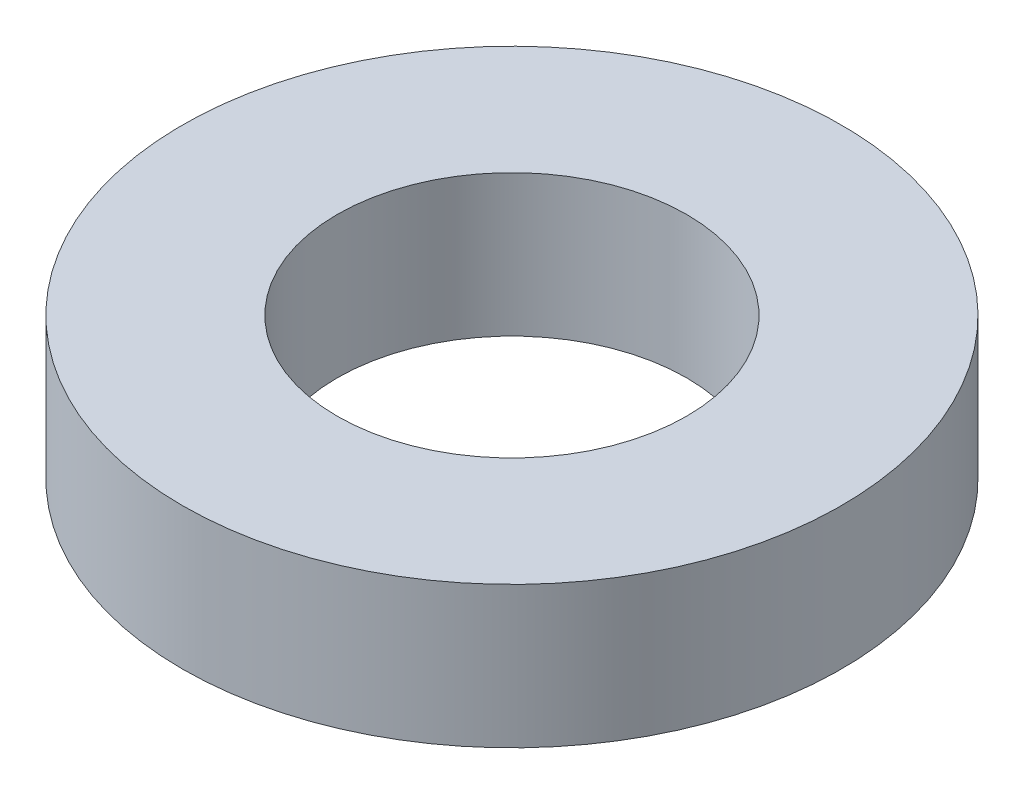
ISO-10303-21;
HEADER;
FILE_DESCRIPTION(('STEP AP214'),'2;1');
FILE_NAME('part.step','',(''),(''),'','','');
FILE_SCHEMA(('AUTOMOTIVE_DESIGN { 1 0 10303 214 1 1 1 1 }'));
ENDSEC;
DATA;
#1=APPLICATION_CONTEXT('core data for automotive mechanical design processes');
#2=APPLICATION_PROTOCOL_DEFINITION('international standard','automotive_design',2000,#1);
#3=PRODUCT_CONTEXT('',#1,'mechanical');
#4=PRODUCT('Part','Part','',(#3));
#5=PRODUCT_RELATED_PRODUCT_CATEGORY('part','',(#4));
#6=PRODUCT_DEFINITION_FORMATION('','',#4);
#7=PRODUCT_DEFINITION_CONTEXT('part definition',#1,'design');
#8=PRODUCT_DEFINITION('design','',#6,#7);
#9=PRODUCT_DEFINITION_SHAPE('','',#8);
#10=(LENGTH_UNIT() NAMED_UNIT(*) SI_UNIT(.MILLI.,.METRE.));
#11=(NAMED_UNIT(*) PLANE_ANGLE_UNIT() SI_UNIT($,.RADIAN.));
#12=(NAMED_UNIT(*) SI_UNIT($,.STERADIAN.) SOLID_ANGLE_UNIT());
#13=UNCERTAINTY_MEASURE_WITH_UNIT(LENGTH_MEASURE(1.E-05),#10,'distance_accuracy_value','');
#14=(GEOMETRIC_REPRESENTATION_CONTEXT(3) GLOBAL_UNCERTAINTY_ASSIGNED_CONTEXT((#13)) GLOBAL_UNIT_ASSIGNED_CONTEXT((#10,
#11,#12)) REPRESENTATION_CONTEXT('',''));
#15=CARTESIAN_POINT('',(0.,0.,0.));
#16=DIRECTION('',(0.,0.,1.));
#17=DIRECTION('',(1.,0.,0.));
#18=AXIS2_PLACEMENT_3D('',#15,#16,#17);
#19=CARTESIAN_POINT('',(0.,0.8128,2.05874844840537));
#20=DIRECTION('',(0.,1.,0.));
#21=DIRECTION('',(0.,0.,1.));
#22=AXIS2_PLACEMENT_3D('',#19,#20,#21);
#23=PLANE('',#22);
#24=CARTESIAN_POINT('',(0.,0.8128,2.05874844840537));
#25=DIRECTION('',(0.,1.,0.));
#26=DIRECTION('',(0.,0.,1.));
#27=AXIS2_PLACEMENT_3D('',#24,#25,#26);
#28=CIRCLE('',#27,1.8923);
#29=CARTESIAN_POINT('',(0.,0.8128,3.95104844840537));
#30=VERTEX_POINT('',#29);
#31=EDGE_CURVE('E10',#30,#30,#28,.T.);
#32=ORIENTED_EDGE('',*,*,#31,.T.);
#33=EDGE_LOOP('',(#32));
#34=FACE_BOUND('',#33,.T.);
#35=CARTESIAN_POINT('',(0.,0.8128,2.05874844840537));
#36=DIRECTION('',(0.,1.,0.));
#37=DIRECTION('',(0.,0.,1.));
#38=AXIS2_PLACEMENT_3D('',#35,#36,#37);
#39=CIRCLE('',#38,1.0033);
#40=CARTESIAN_POINT('',(0.,0.8128,3.06204844840537));
#41=VERTEX_POINT('',#40);
#42=EDGE_CURVE('E41',#41,#41,#39,.T.);
#43=ORIENTED_EDGE('',*,*,#42,.F.);
#44=EDGE_LOOP('',(#43));
#45=FACE_BOUND('',#44,.T.);
#46=ADVANCED_FACE('F30',(#34,#45),#23,.T.);
#47=CARTESIAN_POINT('',(0.,0.,2.05874844840537));
#48=DIRECTION('',(0.,1.,0.));
#49=DIRECTION('',(0.,0.,1.));
#50=AXIS2_PLACEMENT_3D('',#47,#48,#49);
#51=PLANE('',#50);
#52=CARTESIAN_POINT('',(0.,0.,2.05874844840537));
#53=DIRECTION('',(0.,1.,0.));
#54=DIRECTION('',(0.,0.,1.));
#55=AXIS2_PLACEMENT_3D('',#52,#53,#54);
#56=CIRCLE('',#55,1.8923);
#57=CARTESIAN_POINT('',(0.,0.,3.95104844840537));
#58=VERTEX_POINT('',#57);
#59=EDGE_CURVE('E34',#58,#58,#56,.T.);
#60=ORIENTED_EDGE('',*,*,#59,.F.);
#61=EDGE_LOOP('',(#60));
#62=FACE_BOUND('',#61,.T.);
#63=CARTESIAN_POINT('',(0.,0.,2.05874844840537));
#64=DIRECTION('',(0.,1.,0.));
#65=DIRECTION('',(0.,0.,1.));
#66=AXIS2_PLACEMENT_3D('',#63,#64,#65);
#67=CIRCLE('',#66,1.0033);
#68=CARTESIAN_POINT('',(0.,0.,3.06204844840537));
#69=VERTEX_POINT('',#68);
#70=EDGE_CURVE('E43',#69,#69,#67,.T.);
#71=ORIENTED_EDGE('',*,*,#70,.T.);
#72=EDGE_LOOP('',(#71));
#73=FACE_BOUND('',#72,.T.);
#74=ADVANCED_FACE('F53',(#62,#73),#51,.F.);
#75=CARTESIAN_POINT('',(0.,0.8128,2.05874844840537));
#76=DIRECTION('',(0.,-1.,0.));
#77=DIRECTION('',(0.,0.,-1.));
#78=AXIS2_PLACEMENT_3D('',#75,#76,#77);
#79=CYLINDRICAL_SURFACE('',#78,1.8923);
#80=ORIENTED_EDGE('',*,*,#31,.F.);
#81=EDGE_LOOP('',(#80));
#82=FACE_BOUND('',#81,.T.);
#83=ORIENTED_EDGE('',*,*,#59,.T.);
#84=EDGE_LOOP('',(#83));
#85=FACE_BOUND('',#84,.T.);
#86=ADVANCED_FACE('F32',(#82,#85),#79,.T.);
#87=CARTESIAN_POINT('',(0.,0.8128,2.05874844840537));
#88=DIRECTION('',(0.,-1.,0.));
#89=DIRECTION('',(0.,0.,-1.));
#90=AXIS2_PLACEMENT_3D('',#87,#88,#89);
#91=CYLINDRICAL_SURFACE('',#90,1.0033);
#92=ORIENTED_EDGE('',*,*,#42,.T.);
#93=EDGE_LOOP('',(#92));
#94=FACE_BOUND('',#93,.T.);
#95=ORIENTED_EDGE('',*,*,#70,.F.);
#96=EDGE_LOOP('',(#95));
#97=FACE_BOUND('',#96,.T.);
#98=ADVANCED_FACE('F49',(#94,#97),#91,.F.);
#99=CLOSED_SHELL('',(#46,#74,#86,#98));
#100=MANIFOLD_SOLID_BREP('B2',#99);
#101=ADVANCED_BREP_SHAPE_REPRESENTATION('',(#18,#100),#14);
#102=SHAPE_DEFINITION_REPRESENTATION(#9,#101);
ENDSEC;
END-ISO-10303-21;
